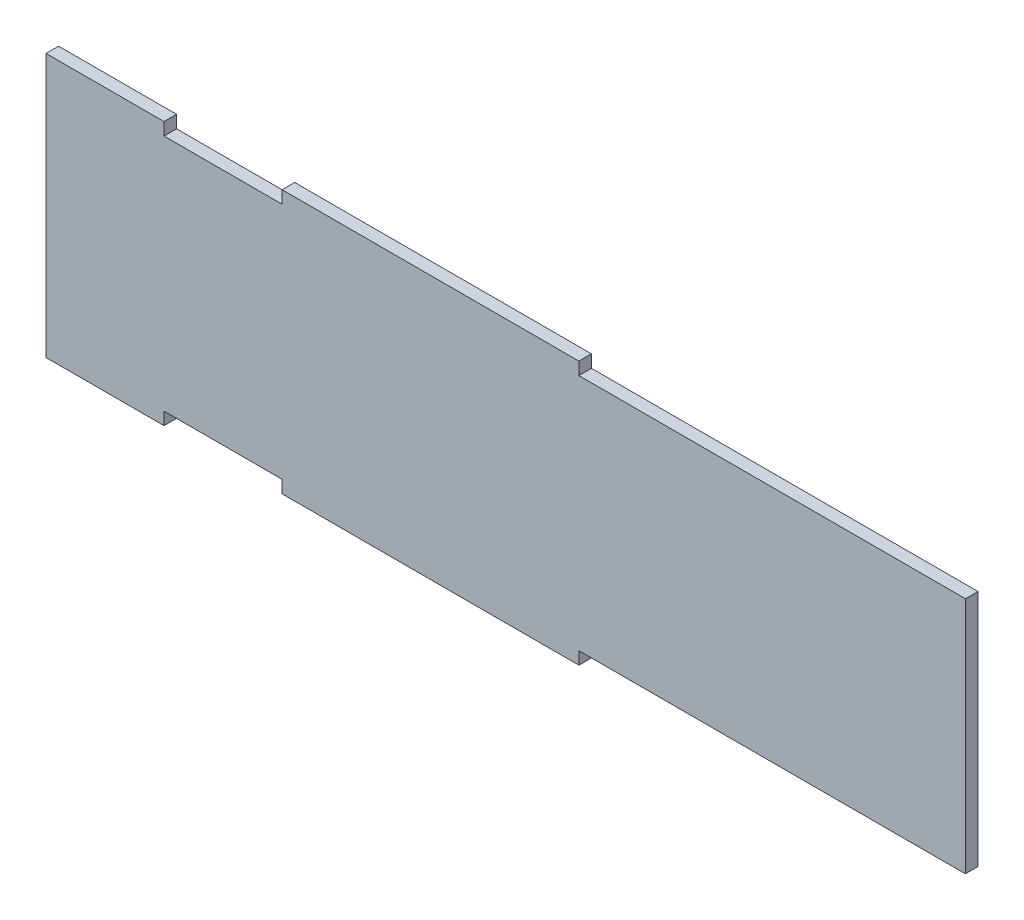
ISO-10303-21;
HEADER;
FILE_DESCRIPTION(('STEP AP214'),'2;1');
FILE_NAME('part.step','',(''),(''),'','','');
FILE_SCHEMA(('AUTOMOTIVE_DESIGN { 1 0 10303 214 1 1 1 1 }'));
ENDSEC;
DATA;
#1=APPLICATION_CONTEXT('core data for automotive mechanical design processes');
#2=APPLICATION_PROTOCOL_DEFINITION('international standard','automotive_design',2000,#1);
#3=PRODUCT_CONTEXT('',#1,'mechanical');
#4=PRODUCT('Part','Part','',(#3));
#5=PRODUCT_RELATED_PRODUCT_CATEGORY('part','',(#4));
#6=PRODUCT_DEFINITION_FORMATION('','',#4);
#7=PRODUCT_DEFINITION_CONTEXT('part definition',#1,'design');
#8=PRODUCT_DEFINITION('design','',#6,#7);
#9=PRODUCT_DEFINITION_SHAPE('','',#8);
#10=(LENGTH_UNIT() NAMED_UNIT(*) SI_UNIT(.MILLI.,.METRE.));
#11=(NAMED_UNIT(*) PLANE_ANGLE_UNIT() SI_UNIT($,.RADIAN.));
#12=(NAMED_UNIT(*) SI_UNIT($,.STERADIAN.) SOLID_ANGLE_UNIT());
#13=UNCERTAINTY_MEASURE_WITH_UNIT(LENGTH_MEASURE(1.E-05),#10,'distance_accuracy_value','');
#14=(GEOMETRIC_REPRESENTATION_CONTEXT(3) GLOBAL_UNCERTAINTY_ASSIGNED_CONTEXT((#13)) GLOBAL_UNIT_ASSIGNED_CONTEXT((#10,
#11,#12)) REPRESENTATION_CONTEXT('',''));
#15=CARTESIAN_POINT('',(0.,0.,0.));
#16=DIRECTION('',(0.,0.,1.));
#17=DIRECTION('',(1.,0.,0.));
#18=AXIS2_PLACEMENT_3D('',#15,#16,#17);
#19=CARTESIAN_POINT('',(-197.866,0.,5.4102));
#20=DIRECTION('',(-1.,0.,0.));
#21=DIRECTION('',(0.,-1.,0.));
#22=AXIS2_PLACEMENT_3D('',#19,#20,#21);
#23=PLANE('',#22);
#24=DIRECTION('',(0.,1.,0.));
#25=VECTOR('',#24,1.);
#26=CARTESIAN_POINT('',(-197.866,0.,0.));
#27=LINE('',#26,#25);
#28=CARTESIAN_POINT('',(-197.866,-56.6802270000001,0.));
#29=VERTEX_POINT('',#28);
#30=CARTESIAN_POINT('',(-197.866,56.680227,0.));
#31=VERTEX_POINT('',#30);
#32=EDGE_CURVE('E177',#29,#31,#27,.T.);
#33=ORIENTED_EDGE('',*,*,#32,.F.);
#34=DIRECTION('',(0.,0.,-1.));
#35=VECTOR('',#34,1.);
#36=CARTESIAN_POINT('',(-197.866,-56.6802270000001,5.4102));
#37=LINE('',#36,#35);
#38=CARTESIAN_POINT('',(-197.866,-56.6802270000001,5.4102));
#39=VERTEX_POINT('',#38);
#40=EDGE_CURVE('E11',#39,#29,#37,.T.);
#41=ORIENTED_EDGE('',*,*,#40,.F.);
#42=DIRECTION('',(0.,1.,0.));
#43=VECTOR('',#42,1.);
#44=CARTESIAN_POINT('',(-197.866,0.,5.4102));
#45=LINE('',#44,#43);
#46=CARTESIAN_POINT('',(-197.866,56.680227,5.4102));
#47=VERTEX_POINT('',#46);
#48=EDGE_CURVE('E311',#39,#47,#45,.T.);
#49=ORIENTED_EDGE('',*,*,#48,.T.);
#50=DIRECTION('',(0.,0.,-1.));
#51=VECTOR('',#50,1.);
#52=CARTESIAN_POINT('',(-197.866,56.680227,5.4102));
#53=LINE('',#52,#51);
#54=EDGE_CURVE('E50',#47,#31,#53,.T.);
#55=ORIENTED_EDGE('',*,*,#54,.T.);
#56=EDGE_LOOP('',(#33,#41,#49,#55));
#57=FACE_BOUND('',#56,.T.);
#58=ADVANCED_FACE('F34',(#57),#23,.T.);
#59=CARTESIAN_POINT('',(0.,-56.680227,5.4102));
#60=DIRECTION('',(0.,1.,0.));
#61=DIRECTION('',(-1.,0.,0.));
#62=AXIS2_PLACEMENT_3D('',#59,#60,#61);
#63=PLANE('',#62);
#64=DIRECTION('',(1.,0.,0.));
#65=VECTOR('',#64,1.);
#66=CARTESIAN_POINT('',(0.,-56.680227,0.));
#67=LINE('',#66,#65);
#68=CARTESIAN_POINT('',(-147.066,-56.680227,0.));
#69=VERTEX_POINT('',#68);
#70=EDGE_CURVE('E179',#29,#69,#67,.T.);
#71=ORIENTED_EDGE('',*,*,#70,.T.);
#72=DIRECTION('',(0.,0.,-1.));
#73=VECTOR('',#72,1.);
#74=CARTESIAN_POINT('',(-147.066,-56.680227,5.4102));
#75=LINE('',#74,#73);
#76=CARTESIAN_POINT('',(-147.066,-56.680227,5.4102));
#77=VERTEX_POINT('',#76);
#78=EDGE_CURVE('E42',#77,#69,#75,.T.);
#79=ORIENTED_EDGE('',*,*,#78,.F.);
#80=DIRECTION('',(1.,0.,0.));
#81=VECTOR('',#80,1.);
#82=CARTESIAN_POINT('',(0.,-56.680227,5.4102));
#83=LINE('',#82,#81);
#84=EDGE_CURVE('E265',#39,#77,#83,.T.);
#85=ORIENTED_EDGE('',*,*,#84,.F.);
#86=ORIENTED_EDGE('',*,*,#40,.T.);
#87=EDGE_LOOP('',(#71,#79,#85,#86));
#88=FACE_BOUND('',#87,.T.);
#89=ADVANCED_FACE('F304',(#88),#63,.F.);
#90=CARTESIAN_POINT('',(-147.066,1.50896509684968E-12,5.4102));
#91=DIRECTION('',(-1.,0.,0.));
#92=DIRECTION('',(0.,-1.,0.));
#93=AXIS2_PLACEMENT_3D('',#90,#91,#92);
#94=PLANE('',#93);
#95=DIRECTION('',(0.,1.,0.));
#96=VECTOR('',#95,1.);
#97=CARTESIAN_POINT('',(-147.066,1.50896509684968E-12,0.));
#98=LINE('',#97,#96);
#99=CARTESIAN_POINT('',(-147.066,-51.270027,0.));
#100=VERTEX_POINT('',#99);
#101=EDGE_CURVE('E181',#69,#100,#98,.T.);
#102=ORIENTED_EDGE('',*,*,#101,.T.);
#103=DIRECTION('',(0.,0.,-1.));
#104=VECTOR('',#103,1.);
#105=CARTESIAN_POINT('',(-147.066,-51.270027,5.4102));
#106=LINE('',#105,#104);
#107=CARTESIAN_POINT('',(-147.066,-51.270027,5.4102));
#108=VERTEX_POINT('',#107);
#109=EDGE_CURVE('E237',#108,#100,#106,.T.);
#110=ORIENTED_EDGE('',*,*,#109,.F.);
#111=DIRECTION('',(0.,1.,0.));
#112=VECTOR('',#111,1.);
#113=CARTESIAN_POINT('',(-147.066,1.50896509684968E-12,5.4102));
#114=LINE('',#113,#112);
#115=EDGE_CURVE('E246',#77,#108,#114,.T.);
#116=ORIENTED_EDGE('',*,*,#115,.F.);
#117=ORIENTED_EDGE('',*,*,#78,.T.);
#118=EDGE_LOOP('',(#102,#110,#116,#117));
#119=FACE_BOUND('',#118,.T.);
#120=ADVANCED_FACE('F244',(#119),#94,.F.);
#121=CARTESIAN_POINT('',(0.,-51.270027,5.4102));
#122=DIRECTION('',(0.,1.,0.));
#123=DIRECTION('',(-1.,0.,0.));
#124=AXIS2_PLACEMENT_3D('',#121,#122,#123);
#125=PLANE('',#124);
#126=DIRECTION('',(1.,0.,0.));
#127=VECTOR('',#126,1.);
#128=CARTESIAN_POINT('',(0.,-51.270027,0.));
#129=LINE('',#128,#127);
#130=CARTESIAN_POINT('',(-96.2660000000001,-51.270027,0.));
#131=VERTEX_POINT('',#130);
#132=EDGE_CURVE('E184',#100,#131,#129,.T.);
#133=ORIENTED_EDGE('',*,*,#132,.T.);
#134=DIRECTION('',(0.,0.,-1.));
#135=VECTOR('',#134,1.);
#136=CARTESIAN_POINT('',(-96.2660000000001,-51.270027,5.4102));
#137=LINE('',#136,#135);
#138=CARTESIAN_POINT('',(-96.2660000000001,-51.270027,5.4102));
#139=VERTEX_POINT('',#138);
#140=EDGE_CURVE('E235',#139,#131,#137,.T.);
#141=ORIENTED_EDGE('',*,*,#140,.F.);
#142=DIRECTION('',(1.,0.,0.));
#143=VECTOR('',#142,1.);
#144=CARTESIAN_POINT('',(0.,-51.270027,5.4102));
#145=LINE('',#144,#143);
#146=EDGE_CURVE('E259',#108,#139,#145,.T.);
#147=ORIENTED_EDGE('',*,*,#146,.F.);
#148=ORIENTED_EDGE('',*,*,#109,.T.);
#149=EDGE_LOOP('',(#133,#141,#147,#148));
#150=FACE_BOUND('',#149,.T.);
#151=ADVANCED_FACE('F256',(#150),#125,.F.);
#152=CARTESIAN_POINT('',(-96.2660000000002,-2.4693340747238E-13,5.4102));
#153=DIRECTION('',(-1.,0.,0.));
#154=DIRECTION('',(0.,-1.,0.));
#155=AXIS2_PLACEMENT_3D('',#152,#153,#154);
#156=PLANE('',#155);
#157=DIRECTION('',(0.,1.,0.));
#158=VECTOR('',#157,1.);
#159=CARTESIAN_POINT('',(-96.2660000000002,-2.4693340747238E-13,0.));
#160=LINE('',#159,#158);
#161=CARTESIAN_POINT('',(-96.2660000000001,-56.680227,0.));
#162=VERTEX_POINT('',#161);
#163=EDGE_CURVE('E187',#162,#131,#160,.T.);
#164=ORIENTED_EDGE('',*,*,#163,.F.);
#165=DIRECTION('',(0.,0.,-1.));
#166=VECTOR('',#165,1.);
#167=CARTESIAN_POINT('',(-96.2660000000001,-56.680227,5.4102));
#168=LINE('',#167,#166);
#169=CARTESIAN_POINT('',(-96.2660000000001,-56.680227,5.4102));
#170=VERTEX_POINT('',#169);
#171=EDGE_CURVE('E233',#170,#162,#168,.T.);
#172=ORIENTED_EDGE('',*,*,#171,.F.);
#173=DIRECTION('',(0.,1.,0.));
#174=VECTOR('',#173,1.);
#175=CARTESIAN_POINT('',(-96.2660000000002,-2.4693340747238E-13,5.4102));
#176=LINE('',#175,#174);
#177=EDGE_CURVE('E261',#170,#139,#176,.T.);
#178=ORIENTED_EDGE('',*,*,#177,.T.);
#179=ORIENTED_EDGE('',*,*,#140,.T.);
#180=EDGE_LOOP('',(#164,#172,#178,#179));
#181=FACE_BOUND('',#180,.T.);
#182=ADVANCED_FACE('F334',(#181),#156,.T.);
#183=CARTESIAN_POINT('',(31.4959999999999,-56.680227,0.));
#184=VERTEX_POINT('',#183);
#185=EDGE_CURVE('E182',#162,#184,#67,.T.);
#186=ORIENTED_EDGE('',*,*,#185,.T.);
#187=DIRECTION('',(0.,0.,-1.));
#188=VECTOR('',#187,1.);
#189=CARTESIAN_POINT('',(31.4959999999999,-56.680227,5.4102));
#190=LINE('',#189,#188);
#191=CARTESIAN_POINT('',(31.4959999999999,-56.680227,5.4102));
#192=VERTEX_POINT('',#191);
#193=EDGE_CURVE('E230',#192,#184,#190,.T.);
#194=ORIENTED_EDGE('',*,*,#193,.F.);
#195=EDGE_CURVE('E263',#170,#192,#83,.T.);
#196=ORIENTED_EDGE('',*,*,#195,.F.);
#197=ORIENTED_EDGE('',*,*,#171,.T.);
#198=EDGE_LOOP('',(#186,#194,#196,#197));
#199=FACE_BOUND('',#198,.T.);
#200=ADVANCED_FACE('F309',(#199),#63,.F.);
#201=CARTESIAN_POINT('',(31.4959999999999,0.,5.4102));
#202=DIRECTION('',(-1.,0.,0.));
#203=DIRECTION('',(0.,0.,1.));
#204=AXIS2_PLACEMENT_3D('',#201,#202,#203);
#205=PLANE('',#204);
#206=DIRECTION('',(0.,1.,0.));
#207=VECTOR('',#206,1.);
#208=CARTESIAN_POINT('',(31.4959999999999,0.,0.));
#209=LINE('',#208,#207);
#210=CARTESIAN_POINT('',(31.4959999999999,-51.270027,0.));
#211=VERTEX_POINT('',#210);
#212=EDGE_CURVE('E190',#184,#211,#209,.T.);
#213=ORIENTED_EDGE('',*,*,#212,.T.);
#214=DIRECTION('',(0.,0.,-1.));
#215=VECTOR('',#214,1.);
#216=CARTESIAN_POINT('',(31.4959999999999,-51.270027,5.4102));
#217=LINE('',#216,#215);
#218=CARTESIAN_POINT('',(31.4959999999999,-51.270027,5.4102));
#219=VERTEX_POINT('',#218);
#220=EDGE_CURVE('E227',#219,#211,#217,.T.);
#221=ORIENTED_EDGE('',*,*,#220,.F.);
#222=DIRECTION('',(0.,1.,0.));
#223=VECTOR('',#222,1.);
#224=CARTESIAN_POINT('',(31.4959999999999,0.,5.4102));
#225=LINE('',#224,#223);
#226=EDGE_CURVE('E269',#192,#219,#225,.T.);
#227=ORIENTED_EDGE('',*,*,#226,.F.);
#228=ORIENTED_EDGE('',*,*,#193,.T.);
#229=EDGE_LOOP('',(#213,#221,#227,#228));
#230=FACE_BOUND('',#229,.T.);
#231=ADVANCED_FACE('F320',(#230),#205,.F.);
#232=CARTESIAN_POINT('',(0.,-51.270027,5.4102));
#233=DIRECTION('',(0.,1.,0.));
#234=DIRECTION('',(-1.,0.,0.));
#235=AXIS2_PLACEMENT_3D('',#232,#233,#234);
#236=PLANE('',#235);
#237=DIRECTION('',(1.,0.,0.));
#238=VECTOR('',#237,1.);
#239=CARTESIAN_POINT('',(0.,-51.270027,0.));
#240=LINE('',#239,#238);
#241=CARTESIAN_POINT('',(197.866,-51.270027,0.));
#242=VERTEX_POINT('',#241);
#243=EDGE_CURVE('E192',#211,#242,#240,.T.);
#244=ORIENTED_EDGE('',*,*,#243,.T.);
#245=DIRECTION('',(0.,0.,-1.));
#246=VECTOR('',#245,1.);
#247=CARTESIAN_POINT('',(197.866,-51.270027,5.4102));
#248=LINE('',#247,#246);
#249=CARTESIAN_POINT('',(197.866,-51.270027,5.4102));
#250=VERTEX_POINT('',#249);
#251=EDGE_CURVE('E224',#250,#242,#248,.T.);
#252=ORIENTED_EDGE('',*,*,#251,.F.);
#253=DIRECTION('',(1.,0.,0.));
#254=VECTOR('',#253,1.);
#255=CARTESIAN_POINT('',(0.,-51.270027,5.4102));
#256=LINE('',#255,#254);
#257=EDGE_CURVE('E271',#219,#250,#256,.T.);
#258=ORIENTED_EDGE('',*,*,#257,.F.);
#259=ORIENTED_EDGE('',*,*,#220,.T.);
#260=EDGE_LOOP('',(#244,#252,#258,#259));
#261=FACE_BOUND('',#260,.T.);
#262=ADVANCED_FACE('F325',(#261),#236,.F.);
#263=CARTESIAN_POINT('',(197.866,0.,5.4102));
#264=DIRECTION('',(-1.,0.,0.));
#265=DIRECTION('',(0.,-1.,0.));
#266=AXIS2_PLACEMENT_3D('',#263,#264,#265);
#267=PLANE('',#266);
#268=DIRECTION('',(0.,1.,0.));
#269=VECTOR('',#268,1.);
#270=CARTESIAN_POINT('',(197.866,0.,0.));
#271=LINE('',#270,#269);
#272=CARTESIAN_POINT('',(197.866,51.270027,0.));
#273=VERTEX_POINT('',#272);
#274=EDGE_CURVE('E194',#242,#273,#271,.T.);
#275=ORIENTED_EDGE('',*,*,#274,.T.);
#276=DIRECTION('',(0.,0.,-1.));
#277=VECTOR('',#276,1.);
#278=CARTESIAN_POINT('',(197.866,51.270027,5.4102));
#279=LINE('',#278,#277);
#280=CARTESIAN_POINT('',(197.866,51.270027,5.4102));
#281=VERTEX_POINT('',#280);
#282=EDGE_CURVE('E222',#281,#273,#279,.T.);
#283=ORIENTED_EDGE('',*,*,#282,.F.);
#284=DIRECTION('',(0.,1.,0.));
#285=VECTOR('',#284,1.);
#286=CARTESIAN_POINT('',(197.866,0.,5.4102));
#287=LINE('',#286,#285);
#288=EDGE_CURVE('E273',#250,#281,#287,.T.);
#289=ORIENTED_EDGE('',*,*,#288,.F.);
#290=ORIENTED_EDGE('',*,*,#251,.T.);
#291=EDGE_LOOP('',(#275,#283,#289,#290));
#292=FACE_BOUND('',#291,.T.);
#293=ADVANCED_FACE('F329',(#292),#267,.F.);
#294=CARTESIAN_POINT('',(0.,51.270027,5.4102));
#295=DIRECTION('',(0.,1.,0.));
#296=DIRECTION('',(0.,0.,1.));
#297=AXIS2_PLACEMENT_3D('',#294,#295,#296);
#298=PLANE('',#297);
#299=DIRECTION('',(1.,0.,0.));
#300=VECTOR('',#299,1.);
#301=CARTESIAN_POINT('',(0.,51.270027,0.));
#302=LINE('',#301,#300);
#303=CARTESIAN_POINT('',(31.4959999999999,51.270027,0.));
#304=VERTEX_POINT('',#303);
#305=EDGE_CURVE('E197',#304,#273,#302,.T.);
#306=ORIENTED_EDGE('',*,*,#305,.F.);
#307=DIRECTION('',(0.,0.,-1.));
#308=VECTOR('',#307,1.);
#309=CARTESIAN_POINT('',(31.4959999999999,51.270027,5.4102));
#310=LINE('',#309,#308);
#311=CARTESIAN_POINT('',(31.4959999999999,51.270027,5.4102));
#312=VERTEX_POINT('',#311);
#313=EDGE_CURVE('E220',#312,#304,#310,.T.);
#314=ORIENTED_EDGE('',*,*,#313,.F.);
#315=DIRECTION('',(1.,0.,0.));
#316=VECTOR('',#315,1.);
#317=CARTESIAN_POINT('',(0.,51.270027,5.4102));
#318=LINE('',#317,#316);
#319=EDGE_CURVE('E275',#312,#281,#318,.T.);
#320=ORIENTED_EDGE('',*,*,#319,.T.);
#321=ORIENTED_EDGE('',*,*,#282,.T.);
#322=EDGE_LOOP('',(#306,#314,#320,#321));
#323=FACE_BOUND('',#322,.T.);
#324=ADVANCED_FACE('F332',(#323),#298,.T.);
#325=CARTESIAN_POINT('',(31.4959999999999,0.,5.4102));
#326=DIRECTION('',(1.,0.,0.));
#327=DIRECTION('',(0.,0.,-1.));
#328=AXIS2_PLACEMENT_3D('',#325,#326,#327);
#329=PLANE('',#328);
#330=DIRECTION('',(0.,-1.,0.));
#331=VECTOR('',#330,1.);
#332=CARTESIAN_POINT('',(31.4959999999999,0.,0.));
#333=LINE('',#332,#331);
#334=CARTESIAN_POINT('',(31.4959999999999,56.680227,0.));
#335=VERTEX_POINT('',#334);
#336=EDGE_CURVE('E200',#335,#304,#333,.T.);
#337=ORIENTED_EDGE('',*,*,#336,.F.);
#338=DIRECTION('',(0.,0.,-1.));
#339=VECTOR('',#338,1.);
#340=CARTESIAN_POINT('',(31.4959999999999,56.680227,5.4102));
#341=LINE('',#340,#339);
#342=CARTESIAN_POINT('',(31.4959999999999,56.680227,5.4102));
#343=VERTEX_POINT('',#342);
#344=EDGE_CURVE('E218',#343,#335,#341,.T.);
#345=ORIENTED_EDGE('',*,*,#344,.F.);
#346=DIRECTION('',(0.,-1.,0.));
#347=VECTOR('',#346,1.);
#348=CARTESIAN_POINT('',(31.4959999999999,0.,5.4102));
#349=LINE('',#348,#347);
#350=EDGE_CURVE('E278',#343,#312,#349,.T.);
#351=ORIENTED_EDGE('',*,*,#350,.T.);
#352=ORIENTED_EDGE('',*,*,#313,.T.);
#353=EDGE_LOOP('',(#337,#345,#351,#352));
#354=FACE_BOUND('',#353,.T.);
#355=ADVANCED_FACE('F288',(#354),#329,.T.);
#356=CARTESIAN_POINT('',(0.,56.680227,5.4102));
#357=DIRECTION('',(0.,1.,0.));
#358=DIRECTION('',(-1.,0.,0.));
#359=AXIS2_PLACEMENT_3D('',#356,#357,#358);
#360=PLANE('',#359);
#361=DIRECTION('',(1.,0.,0.));
#362=VECTOR('',#361,1.);
#363=CARTESIAN_POINT('',(0.,56.680227,0.));
#364=LINE('',#363,#362);
#365=CARTESIAN_POINT('',(-96.2660000000001,56.680227,0.));
#366=VERTEX_POINT('',#365);
#367=EDGE_CURVE('E203',#366,#335,#364,.T.);
#368=ORIENTED_EDGE('',*,*,#367,.F.);
#369=DIRECTION('',(0.,0.,-1.));
#370=VECTOR('',#369,1.);
#371=CARTESIAN_POINT('',(-96.2660000000001,56.680227,5.4102));
#372=LINE('',#371,#370);
#373=CARTESIAN_POINT('',(-96.2660000000001,56.680227,5.4102));
#374=VERTEX_POINT('',#373);
#375=EDGE_CURVE('E216',#374,#366,#372,.T.);
#376=ORIENTED_EDGE('',*,*,#375,.F.);
#377=DIRECTION('',(1.,0.,0.));
#378=VECTOR('',#377,1.);
#379=CARTESIAN_POINT('',(0.,56.680227,5.4102));
#380=LINE('',#379,#378);
#381=EDGE_CURVE('E174',#374,#343,#380,.T.);
#382=ORIENTED_EDGE('',*,*,#381,.T.);
#383=ORIENTED_EDGE('',*,*,#344,.T.);
#384=EDGE_LOOP('',(#368,#376,#382,#383));
#385=FACE_BOUND('',#384,.T.);
#386=ADVANCED_FACE('F283',(#385),#360,.T.);
#387=CARTESIAN_POINT('',(-96.2660000000007,9.87733629889525E-13,5.4102));
#388=DIRECTION('',(1.,0.,0.));
#389=DIRECTION('',(0.,1.,0.));
#390=AXIS2_PLACEMENT_3D('',#387,#388,#389);
#391=PLANE('',#390);
#392=DIRECTION('',(0.,-1.,0.));
#393=VECTOR('',#392,1.);
#394=CARTESIAN_POINT('',(-96.2660000000007,9.87733629889525E-13,0.));
#395=LINE('',#394,#393);
#396=CARTESIAN_POINT('',(-96.2660000000001,51.270027,0.));
#397=VERTEX_POINT('',#396);
#398=EDGE_CURVE('E206',#366,#397,#395,.T.);
#399=ORIENTED_EDGE('',*,*,#398,.T.);
#400=DIRECTION('',(0.,0.,-1.));
#401=VECTOR('',#400,1.);
#402=CARTESIAN_POINT('',(-96.2660000000001,51.270027,5.4102));
#403=LINE('',#402,#401);
#404=CARTESIAN_POINT('',(-96.2660000000001,51.270027,5.4102));
#405=VERTEX_POINT('',#404);
#406=EDGE_CURVE('E157',#405,#397,#403,.T.);
#407=ORIENTED_EDGE('',*,*,#406,.F.);
#408=DIRECTION('',(0.,-1.,0.));
#409=VECTOR('',#408,1.);
#410=CARTESIAN_POINT('',(-96.2660000000007,9.87733629889525E-13,5.4102));
#411=LINE('',#410,#409);
#412=EDGE_CURVE('E167',#374,#405,#411,.T.);
#413=ORIENTED_EDGE('',*,*,#412,.F.);
#414=ORIENTED_EDGE('',*,*,#375,.T.);
#415=EDGE_LOOP('',(#399,#407,#413,#414));
#416=FACE_BOUND('',#415,.T.);
#417=ADVANCED_FACE('F292',(#416),#391,.F.);
#418=CARTESIAN_POINT('',(0.,51.270027,5.4102));
#419=DIRECTION('',(0.,1.,0.));
#420=DIRECTION('',(0.,0.,1.));
#421=AXIS2_PLACEMENT_3D('',#418,#419,#420);
#422=PLANE('',#421);
#423=DIRECTION('',(1.,0.,0.));
#424=VECTOR('',#423,1.);
#425=CARTESIAN_POINT('',(0.,51.270027,0.));
#426=LINE('',#425,#424);
#427=CARTESIAN_POINT('',(-147.066,51.270027,0.));
#428=VERTEX_POINT('',#427);
#429=EDGE_CURVE('E153',#428,#397,#426,.T.);
#430=ORIENTED_EDGE('',*,*,#429,.F.);
#431=DIRECTION('',(0.,0.,-1.));
#432=VECTOR('',#431,1.);
#433=CARTESIAN_POINT('',(-147.066,51.270027,5.4102));
#434=LINE('',#433,#432);
#435=CARTESIAN_POINT('',(-147.066,51.270027,5.4102));
#436=VERTEX_POINT('',#435);
#437=EDGE_CURVE('E148',#436,#428,#434,.T.);
#438=ORIENTED_EDGE('',*,*,#437,.F.);
#439=DIRECTION('',(1.,0.,0.));
#440=VECTOR('',#439,1.);
#441=CARTESIAN_POINT('',(0.,51.270027,5.4102));
#442=LINE('',#441,#440);
#443=EDGE_CURVE('E151',#436,#405,#442,.T.);
#444=ORIENTED_EDGE('',*,*,#443,.T.);
#445=ORIENTED_EDGE('',*,*,#406,.T.);
#446=EDGE_LOOP('',(#430,#438,#444,#445));
#447=FACE_BOUND('',#446,.T.);
#448=ADVANCED_FACE('F150',(#447),#422,.T.);
#449=CARTESIAN_POINT('',(-147.066,-7.54482548424842E-13,5.4102));
#450=DIRECTION('',(1.,0.,0.));
#451=DIRECTION('',(0.,1.,0.));
#452=AXIS2_PLACEMENT_3D('',#449,#450,#451);
#453=PLANE('',#452);
#454=DIRECTION('',(0.,-1.,0.));
#455=VECTOR('',#454,1.);
#456=CARTESIAN_POINT('',(-147.066,-7.54482548424842E-13,0.));
#457=LINE('',#456,#455);
#458=CARTESIAN_POINT('',(-147.066,56.680227,0.));
#459=VERTEX_POINT('',#458);
#460=EDGE_CURVE('E211',#459,#428,#457,.T.);
#461=ORIENTED_EDGE('',*,*,#460,.F.);
#462=DIRECTION('',(0.,0.,-1.));
#463=VECTOR('',#462,1.);
#464=CARTESIAN_POINT('',(-147.066,56.680227,5.4102));
#465=LINE('',#464,#463);
#466=CARTESIAN_POINT('',(-147.066,56.680227,5.4102));
#467=VERTEX_POINT('',#466);
#468=EDGE_CURVE('E99',#467,#459,#465,.T.);
#469=ORIENTED_EDGE('',*,*,#468,.F.);
#470=DIRECTION('',(0.,-1.,0.));
#471=VECTOR('',#470,1.);
#472=CARTESIAN_POINT('',(-147.066,-7.54482548424842E-13,5.4102));
#473=LINE('',#472,#471);
#474=EDGE_CURVE('E164',#467,#436,#473,.T.);
#475=ORIENTED_EDGE('',*,*,#474,.T.);
#476=ORIENTED_EDGE('',*,*,#437,.T.);
#477=EDGE_LOOP('',(#461,#469,#475,#476));
#478=FACE_BOUND('',#477,.T.);
#479=ADVANCED_FACE('F170',(#478),#453,.T.);
#480=EDGE_CURVE('E207',#31,#459,#364,.T.);
#481=ORIENTED_EDGE('',*,*,#480,.F.);
#482=ORIENTED_EDGE('',*,*,#54,.F.);
#483=EDGE_CURVE('E171',#47,#467,#380,.T.);
#484=ORIENTED_EDGE('',*,*,#483,.T.);
#485=ORIENTED_EDGE('',*,*,#468,.T.);
#486=EDGE_LOOP('',(#481,#482,#484,#485));
#487=FACE_BOUND('',#486,.T.);
#488=ADVANCED_FACE('F301',(#487),#360,.T.);
#489=CARTESIAN_POINT('',(0.,0.,5.4102));
#490=DIRECTION('',(0.,0.,1.));
#491=DIRECTION('',(1.,0.,0.));
#492=AXIS2_PLACEMENT_3D('',#489,#490,#491);
#493=PLANE('',#492);
#494=ORIENTED_EDGE('',*,*,#48,.F.);
#495=ORIENTED_EDGE('',*,*,#84,.T.);
#496=ORIENTED_EDGE('',*,*,#115,.T.);
#497=ORIENTED_EDGE('',*,*,#146,.T.);
#498=ORIENTED_EDGE('',*,*,#177,.F.);
#499=ORIENTED_EDGE('',*,*,#195,.T.);
#500=ORIENTED_EDGE('',*,*,#226,.T.);
#501=ORIENTED_EDGE('',*,*,#257,.T.);
#502=ORIENTED_EDGE('',*,*,#288,.T.);
#503=ORIENTED_EDGE('',*,*,#319,.F.);
#504=ORIENTED_EDGE('',*,*,#350,.F.);
#505=ORIENTED_EDGE('',*,*,#381,.F.);
#506=ORIENTED_EDGE('',*,*,#412,.T.);
#507=ORIENTED_EDGE('',*,*,#443,.F.);
#508=ORIENTED_EDGE('',*,*,#474,.F.);
#509=ORIENTED_EDGE('',*,*,#483,.F.);
#510=EDGE_LOOP('',(#494,#495,#496,#497,#498,#499,#500,#501,#502,#503,#504,#505,#506,#507,#508,#509));
#511=FACE_BOUND('',#510,.T.);
#512=ADVANCED_FACE('F162',(#511),#493,.T.);
#513=CARTESIAN_POINT('',(0.,0.,0.));
#514=DIRECTION('',(0.,0.,1.));
#515=DIRECTION('',(1.,0.,0.));
#516=AXIS2_PLACEMENT_3D('',#513,#514,#515);
#517=PLANE('',#516);
#518=ORIENTED_EDGE('',*,*,#32,.T.);
#519=ORIENTED_EDGE('',*,*,#480,.T.);
#520=ORIENTED_EDGE('',*,*,#460,.T.);
#521=ORIENTED_EDGE('',*,*,#429,.T.);
#522=ORIENTED_EDGE('',*,*,#398,.F.);
#523=ORIENTED_EDGE('',*,*,#367,.T.);
#524=ORIENTED_EDGE('',*,*,#336,.T.);
#525=ORIENTED_EDGE('',*,*,#305,.T.);
#526=ORIENTED_EDGE('',*,*,#274,.F.);
#527=ORIENTED_EDGE('',*,*,#243,.F.);
#528=ORIENTED_EDGE('',*,*,#212,.F.);
#529=ORIENTED_EDGE('',*,*,#185,.F.);
#530=ORIENTED_EDGE('',*,*,#163,.T.);
#531=ORIENTED_EDGE('',*,*,#132,.F.);
#532=ORIENTED_EDGE('',*,*,#101,.F.);
#533=ORIENTED_EDGE('',*,*,#70,.F.);
#534=EDGE_LOOP('',(#518,#519,#520,#521,#522,#523,#524,#525,#526,#527,#528,#529,#530,#531,#532,#533));
#535=FACE_BOUND('',#534,.T.);
#536=ADVANCED_FACE('F251',(#535),#517,.F.);
#537=CLOSED_SHELL('',(#58,#89,#120,#151,#182,#200,#231,#262,#293,#324,#355,#386,#417,#448,#479,
#488,#512,#536));
#538=MANIFOLD_SOLID_BREP('B2',#537);
#539=ADVANCED_BREP_SHAPE_REPRESENTATION('',(#18,#538),#14);
#540=SHAPE_DEFINITION_REPRESENTATION(#9,#539);
ENDSEC;
END-ISO-10303-21;
